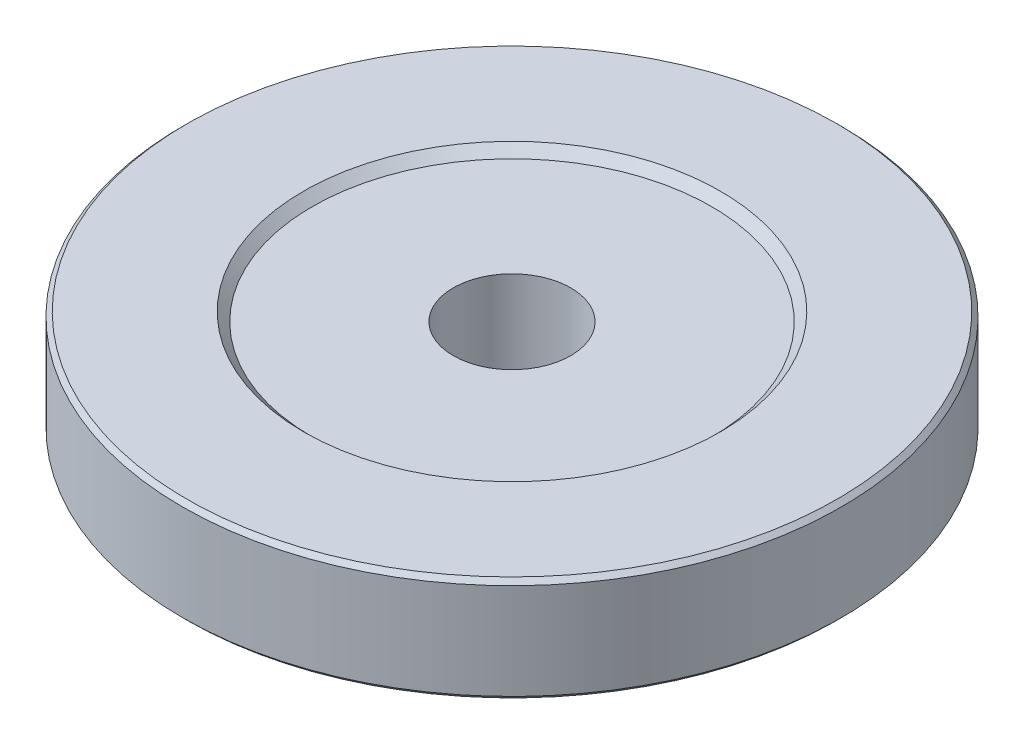
ISO-10303-21;
HEADER;
FILE_DESCRIPTION(('STEP AP214'),'2;1');
FILE_NAME('part.step','',(''),(''),'','','');
FILE_SCHEMA(('AUTOMOTIVE_DESIGN { 1 0 10303 214 1 1 1 1 }'));
ENDSEC;
DATA;
#1=APPLICATION_CONTEXT('core data for automotive mechanical design processes');
#2=APPLICATION_PROTOCOL_DEFINITION('international standard','automotive_design',2000,#1);
#3=PRODUCT_CONTEXT('',#1,'mechanical');
#4=PRODUCT('Part','Part','',(#3));
#5=PRODUCT_RELATED_PRODUCT_CATEGORY('part','',(#4));
#6=PRODUCT_DEFINITION_FORMATION('','',#4);
#7=PRODUCT_DEFINITION_CONTEXT('part definition',#1,'design');
#8=PRODUCT_DEFINITION('design','',#6,#7);
#9=PRODUCT_DEFINITION_SHAPE('','',#8);
#10=(LENGTH_UNIT() NAMED_UNIT(*) SI_UNIT(.MILLI.,.METRE.));
#11=(NAMED_UNIT(*) PLANE_ANGLE_UNIT() SI_UNIT($,.RADIAN.));
#12=(NAMED_UNIT(*) SI_UNIT($,.STERADIAN.) SOLID_ANGLE_UNIT());
#13=UNCERTAINTY_MEASURE_WITH_UNIT(LENGTH_MEASURE(1.E-05),#10,'distance_accuracy_value','');
#14=(GEOMETRIC_REPRESENTATION_CONTEXT(3) GLOBAL_UNCERTAINTY_ASSIGNED_CONTEXT((#13)) GLOBAL_UNIT_ASSIGNED_CONTEXT((#10,
#11,#12)) REPRESENTATION_CONTEXT('',''));
#15=CARTESIAN_POINT('',(0.,0.,0.));
#16=DIRECTION('',(0.,0.,1.));
#17=DIRECTION('',(1.,0.,0.));
#18=AXIS2_PLACEMENT_3D('',#15,#16,#17);
#19=CARTESIAN_POINT('',(-14.4403107131552,20.1402795028684,0.884490313353581));
#20=DIRECTION('',(0.,1.,0.));
#21=DIRECTION('',(0.,0.,1.));
#22=AXIS2_PLACEMENT_3D('',#19,#20,#21);
#23=CYLINDRICAL_SURFACE('',#22,18.8722);
#24=CARTESIAN_POINT('',(-14.4403107131552,7.16805822611569,0.884490313353581));
#25=DIRECTION('',(0.,1.,0.));
#26=DIRECTION('',(0.,0.,1.));
#27=AXIS2_PLACEMENT_3D('',#24,#25,#26);
#28=CIRCLE('',#27,18.8722);
#29=CARTESIAN_POINT('',(-14.4403107131552,7.16805822611569,19.7566903133536));
#30=VERTEX_POINT('',#29);
#31=EDGE_CURVE('E29',#30,#30,#28,.T.);
#32=ORIENTED_EDGE('',*,*,#31,.T.);
#33=EDGE_LOOP('',(#32));
#34=FACE_BOUND('',#33,.T.);
#35=CARTESIAN_POINT('',(-14.4403107131552,12.6600582261157,0.884490313353581));
#36=DIRECTION('',(0.,-1.,0.));
#37=DIRECTION('',(0.,0.,-1.));
#38=AXIS2_PLACEMENT_3D('',#35,#36,#37);
#39=CIRCLE('',#38,18.8722);
#40=CARTESIAN_POINT('',(-14.4403107131552,12.6600582261157,-17.9877096866464));
#41=VERTEX_POINT('',#40);
#42=EDGE_CURVE('E35',#41,#41,#39,.T.);
#43=ORIENTED_EDGE('',*,*,#42,.T.);
#44=EDGE_LOOP('',(#43));
#45=FACE_BOUND('',#44,.T.);
#46=ADVANCED_FACE('F14',(#34,#45),#23,.T.);
#47=CARTESIAN_POINT('',(4.43188928684479,6.91405822611569,0.884490313353581));
#48=DIRECTION('',(0.,1.,0.));
#49=DIRECTION('',(0.,0.,1.));
#50=AXIS2_PLACEMENT_3D('',#47,#48,#49);
#51=PLANE('',#50);
#52=CARTESIAN_POINT('',(-14.4403107131552,6.91405822611569,0.884490313353581));
#53=DIRECTION('',(0.,1.,0.));
#54=DIRECTION('',(0.,0.,1.));
#55=AXIS2_PLACEMENT_3D('',#52,#53,#54);
#56=CIRCLE('',#55,18.6182);
#57=CARTESIAN_POINT('',(-14.4403107131552,6.91405822611569,19.5026903133536));
#58=VERTEX_POINT('',#57);
#59=EDGE_CURVE('E22',#58,#58,#56,.F.);
#60=ORIENTED_EDGE('',*,*,#59,.T.);
#61=EDGE_LOOP('',(#60));
#62=FACE_BOUND('',#61,.T.);
#63=CARTESIAN_POINT('',(-14.4403107131552,6.91405822611568,0.884490313353581));
#64=DIRECTION('',(0.,1.,0.));
#65=DIRECTION('',(0.,0.,1.));
#66=AXIS2_PLACEMENT_3D('',#63,#64,#65);
#67=CIRCLE('',#66,11.938);
#68=CARTESIAN_POINT('',(-14.4403107131552,6.91405822611568,12.8224903133536));
#69=VERTEX_POINT('',#68);
#70=EDGE_CURVE('E41',#69,#69,#67,.T.);
#71=ORIENTED_EDGE('',*,*,#70,.T.);
#72=EDGE_LOOP('',(#71));
#73=FACE_BOUND('',#72,.T.);
#74=ADVANCED_FACE('F83',(#62,#73),#51,.F.);
#75=CARTESIAN_POINT('',(-14.4403107131552,7.42205822611568,0.884490313353581));
#76=DIRECTION('',(0.,-1.,0.));
#77=DIRECTION('',(0.,0.,-1.));
#78=AXIS2_PLACEMENT_3D('',#75,#76,#77);
#79=CONICAL_SURFACE('',#78,11.43,0.785398163397447);
#80=ORIENTED_EDGE('',*,*,#70,.F.);
#81=EDGE_LOOP('',(#80));
#82=FACE_BOUND('',#81,.T.);
#83=CARTESIAN_POINT('',(-14.4403107131552,7.42205822611568,0.884490313353581));
#84=DIRECTION('',(0.,1.,0.));
#85=DIRECTION('',(0.,0.,1.));
#86=AXIS2_PLACEMENT_3D('',#83,#84,#85);
#87=CIRCLE('',#86,11.43);
#88=CARTESIAN_POINT('',(-14.4403107131552,7.42205822611568,12.3144903133536));
#89=VERTEX_POINT('',#88);
#90=EDGE_CURVE('E45',#89,#89,#87,.T.);
#91=ORIENTED_EDGE('',*,*,#90,.T.);
#92=EDGE_LOOP('',(#91));
#93=FACE_BOUND('',#92,.T.);
#94=ADVANCED_FACE('F89',(#82,#93),#79,.F.);
#95=CARTESIAN_POINT('',(-3.01031071315521,7.42205822611568,0.884490313353581));
#96=DIRECTION('',(0.,1.,0.));
#97=DIRECTION('',(0.,0.,1.));
#98=AXIS2_PLACEMENT_3D('',#95,#96,#97);
#99=PLANE('',#98);
#100=ORIENTED_EDGE('',*,*,#90,.F.);
#101=EDGE_LOOP('',(#100));
#102=FACE_BOUND('',#101,.T.);
#103=CARTESIAN_POINT('',(-14.4403107131552,7.42205822611568,0.884490313353581));
#104=DIRECTION('',(0.,1.,0.));
#105=DIRECTION('',(0.,0.,1.));
#106=AXIS2_PLACEMENT_3D('',#103,#104,#105);
#107=CIRCLE('',#106,3.3655);
#108=CARTESIAN_POINT('',(-14.4403107131552,7.42205822611568,4.24999031335358));
#109=VERTEX_POINT('',#108);
#110=EDGE_CURVE('E49',#109,#109,#107,.T.);
#111=ORIENTED_EDGE('',*,*,#110,.T.);
#112=EDGE_LOOP('',(#111));
#113=FACE_BOUND('',#112,.T.);
#114=ADVANCED_FACE('F95',(#102,#113),#99,.F.);
#115=CARTESIAN_POINT('',(-14.4403107131552,20.1402795028684,0.884490313353581));
#116=DIRECTION('',(0.,1.,0.));
#117=DIRECTION('',(0.,0.,1.));
#118=AXIS2_PLACEMENT_3D('',#115,#116,#117);
#119=CYLINDRICAL_SURFACE('',#118,3.3655);
#120=ORIENTED_EDGE('',*,*,#110,.F.);
#121=EDGE_LOOP('',(#120));
#122=FACE_BOUND('',#121,.T.);
#123=CARTESIAN_POINT('',(-14.4403107131552,12.4060582261157,0.884490313353581));
#124=DIRECTION('',(0.,1.,0.));
#125=DIRECTION('',(0.,0.,1.));
#126=AXIS2_PLACEMENT_3D('',#123,#124,#125);
#127=CIRCLE('',#126,3.3655);
#128=CARTESIAN_POINT('',(-14.4403107131552,12.4060582261157,4.24999031335358));
#129=VERTEX_POINT('',#128);
#130=EDGE_CURVE('E53',#129,#129,#127,.T.);
#131=ORIENTED_EDGE('',*,*,#130,.T.);
#132=EDGE_LOOP('',(#131));
#133=FACE_BOUND('',#132,.T.);
#134=ADVANCED_FACE('F99',(#122,#133),#119,.F.);
#135=CARTESIAN_POINT('',(-3.01031071315521,12.4060582261157,0.884490313353581));
#136=DIRECTION('',(0.,-1.,0.));
#137=DIRECTION('',(0.,0.,-1.));
#138=AXIS2_PLACEMENT_3D('',#135,#136,#137);
#139=PLANE('',#138);
#140=ORIENTED_EDGE('',*,*,#130,.F.);
#141=EDGE_LOOP('',(#140));
#142=FACE_BOUND('',#141,.T.);
#143=CARTESIAN_POINT('',(-14.4403107131552,12.4060582261157,0.884490313353581));
#144=DIRECTION('',(0.,1.,0.));
#145=DIRECTION('',(0.,0.,1.));
#146=AXIS2_PLACEMENT_3D('',#143,#144,#145);
#147=CIRCLE('',#146,11.43);
#148=CARTESIAN_POINT('',(-14.4403107131552,12.4060582261157,12.3144903133536));
#149=VERTEX_POINT('',#148);
#150=EDGE_CURVE('E57',#149,#149,#147,.T.);
#151=ORIENTED_EDGE('',*,*,#150,.T.);
#152=EDGE_LOOP('',(#151));
#153=FACE_BOUND('',#152,.T.);
#154=ADVANCED_FACE('F79',(#142,#153),#139,.F.);
#155=CARTESIAN_POINT('',(-14.4403107131552,12.9140582261157,0.884490313353581));
#156=DIRECTION('',(0.,1.,0.));
#157=DIRECTION('',(0.,0.,1.));
#158=AXIS2_PLACEMENT_3D('',#155,#156,#157);
#159=CONICAL_SURFACE('',#158,11.938,0.785398163397453);
#160=ORIENTED_EDGE('',*,*,#150,.F.);
#161=EDGE_LOOP('',(#160));
#162=FACE_BOUND('',#161,.T.);
#163=CARTESIAN_POINT('',(-14.4403107131552,12.9140582261157,0.884490313353581));
#164=DIRECTION('',(0.,1.,0.));
#165=DIRECTION('',(0.,0.,1.));
#166=AXIS2_PLACEMENT_3D('',#163,#164,#165);
#167=CIRCLE('',#166,11.938);
#168=CARTESIAN_POINT('',(-14.4403107131552,12.9140582261157,12.8224903133536));
#169=VERTEX_POINT('',#168);
#170=EDGE_CURVE('E61',#169,#169,#167,.T.);
#171=ORIENTED_EDGE('',*,*,#170,.T.);
#172=EDGE_LOOP('',(#171));
#173=FACE_BOUND('',#172,.T.);
#174=ADVANCED_FACE('F67',(#162,#173),#159,.F.);
#175=CARTESIAN_POINT('',(-2.50231071315521,12.9140582261157,0.884490313353581));
#176=DIRECTION('',(0.,-1.,0.));
#177=DIRECTION('',(0.,0.,-1.));
#178=AXIS2_PLACEMENT_3D('',#175,#176,#177);
#179=PLANE('',#178);
#180=CARTESIAN_POINT('',(-14.4403107131552,12.9140582261157,0.884490313353581));
#181=DIRECTION('',(0.,-1.,0.));
#182=DIRECTION('',(0.,0.,-1.));
#183=AXIS2_PLACEMENT_3D('',#180,#181,#182);
#184=CIRCLE('',#183,18.6182);
#185=CARTESIAN_POINT('',(-14.4403107131552,12.9140582261157,-17.7337096866464));
#186=VERTEX_POINT('',#185);
#187=EDGE_CURVE('E10',#186,#186,#184,.F.);
#188=ORIENTED_EDGE('',*,*,#187,.T.);
#189=EDGE_LOOP('',(#188));
#190=FACE_BOUND('',#189,.T.);
#191=ORIENTED_EDGE('',*,*,#170,.F.);
#192=EDGE_LOOP('',(#191));
#193=FACE_BOUND('',#192,.T.);
#194=ADVANCED_FACE('F69',(#190,#193),#179,.F.);
#195=CARTESIAN_POINT('',(-14.4403107131552,7.16805822611569,0.884490313353581));
#196=DIRECTION('',(0.,1.,0.));
#197=DIRECTION('',(0.,0.,1.));
#198=AXIS2_PLACEMENT_3D('',#195,#196,#197);
#199=CONICAL_SURFACE('',#198,18.8722,0.785398163397448);
#200=ORIENTED_EDGE('',*,*,#59,.F.);
#201=EDGE_LOOP('',(#200));
#202=FACE_BOUND('',#201,.T.);
#203=ORIENTED_EDGE('',*,*,#31,.F.);
#204=EDGE_LOOP('',(#203));
#205=FACE_BOUND('',#204,.T.);
#206=ADVANCED_FACE('F71',(#202,#205),#199,.T.);
#207=CARTESIAN_POINT('',(-14.4403107131552,12.9140582261157,0.884490313353581));
#208=DIRECTION('',(0.,-1.,0.));
#209=DIRECTION('',(0.,0.,-1.));
#210=AXIS2_PLACEMENT_3D('',#207,#208,#209);
#211=CONICAL_SURFACE('',#210,18.6182,0.785398163397455);
#212=ORIENTED_EDGE('',*,*,#42,.F.);
#213=EDGE_LOOP('',(#212));
#214=FACE_BOUND('',#213,.T.);
#215=ORIENTED_EDGE('',*,*,#187,.F.);
#216=EDGE_LOOP('',(#215));
#217=FACE_BOUND('',#216,.T.);
#218=ADVANCED_FACE('F16',(#214,#217),#211,.T.);
#219=CLOSED_SHELL('',(#46,#74,#94,#114,#134,#154,#174,#194,#206,#218));
#220=MANIFOLD_SOLID_BREP('B1',#219);
#221=ADVANCED_BREP_SHAPE_REPRESENTATION('',(#18,#220),#14);
#222=SHAPE_DEFINITION_REPRESENTATION(#9,#221);
ENDSEC;
END-ISO-10303-21;
